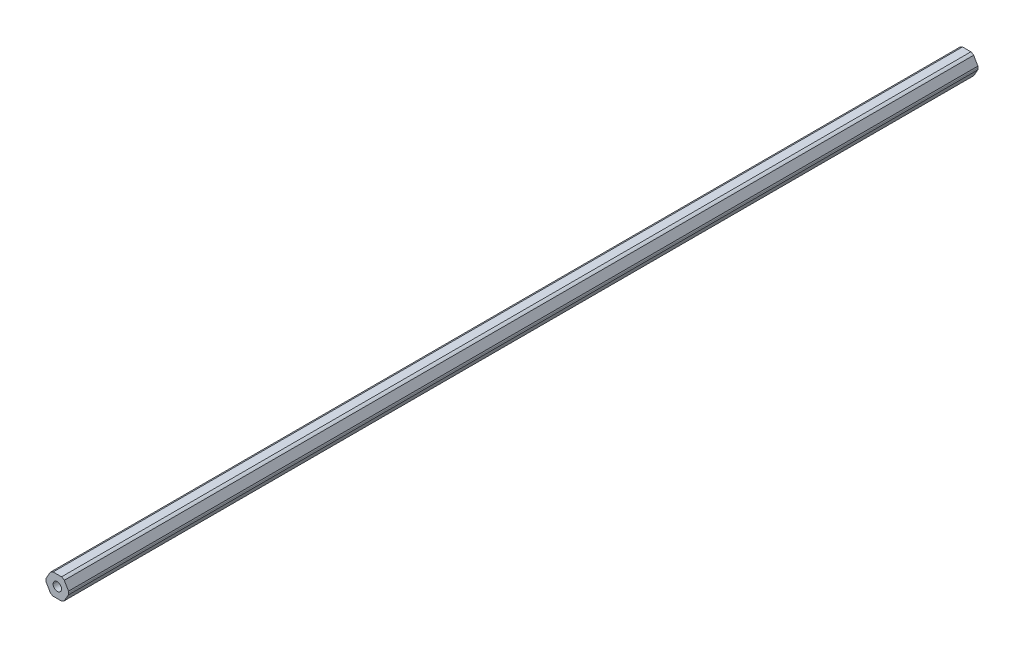
ISO-10303-21;
HEADER;
FILE_DESCRIPTION(('STEP AP214'),'2;1');
FILE_NAME('part.step','',(''),(''),'','','');
FILE_SCHEMA(('AUTOMOTIVE_DESIGN { 1 0 10303 214 1 1 1 1 }'));
ENDSEC;
DATA;
#1=APPLICATION_CONTEXT('core data for automotive mechanical design processes');
#2=APPLICATION_PROTOCOL_DEFINITION('international standard','automotive_design',2000,#1);
#3=PRODUCT_CONTEXT('',#1,'mechanical');
#4=PRODUCT('Part','Part','',(#3));
#5=PRODUCT_RELATED_PRODUCT_CATEGORY('part','',(#4));
#6=PRODUCT_DEFINITION_FORMATION('','',#4);
#7=PRODUCT_DEFINITION_CONTEXT('part definition',#1,'design');
#8=PRODUCT_DEFINITION('design','',#6,#7);
#9=PRODUCT_DEFINITION_SHAPE('','',#8);
#10=(LENGTH_UNIT() NAMED_UNIT(*) SI_UNIT(.MILLI.,.METRE.));
#11=(NAMED_UNIT(*) PLANE_ANGLE_UNIT() SI_UNIT($,.RADIAN.));
#12=(NAMED_UNIT(*) SI_UNIT($,.STERADIAN.) SOLID_ANGLE_UNIT());
#13=UNCERTAINTY_MEASURE_WITH_UNIT(LENGTH_MEASURE(1.E-05),#10,'distance_accuracy_value','');
#14=(GEOMETRIC_REPRESENTATION_CONTEXT(3) GLOBAL_UNCERTAINTY_ASSIGNED_CONTEXT((#13)) GLOBAL_UNIT_ASSIGNED_CONTEXT((#10,
#11,#12)) REPRESENTATION_CONTEXT('',''));
#15=CARTESIAN_POINT('',(0.,0.,0.));
#16=DIRECTION('',(0.,0.,1.));
#17=DIRECTION('',(1.,0.,0.));
#18=AXIS2_PLACEMENT_3D('',#15,#16,#17);
#19=CARTESIAN_POINT('',(0.,0.,-457.2));
#20=DIRECTION('',(0.,0.,1.));
#21=DIRECTION('',(1.,0.,0.));
#22=AXIS2_PLACEMENT_3D('',#19,#20,#21);
#23=CYLINDRICAL_SURFACE('',#22,2.55);
#24=CARTESIAN_POINT('',(0.,0.,-95.25));
#25=DIRECTION('',(0.,0.,-1.));
#26=DIRECTION('',(-1.,0.,0.));
#27=AXIS2_PLACEMENT_3D('',#24,#25,#26);
#28=CIRCLE('',#27,2.55);
#29=CARTESIAN_POINT('',(2.55,0.,-95.25));
#30=VERTEX_POINT('',#29);
#31=CARTESIAN_POINT('',(-2.55,0.,-95.25));
#32=VERTEX_POINT('',#31);
#33=EDGE_CURVE('E65',#30,#32,#28,.F.);
#34=ORIENTED_EDGE('',*,*,#33,.F.);
#35=DIRECTION('',(0.,0.,1.));
#36=VECTOR('',#35,1.);
#37=CARTESIAN_POINT('',(2.55,0.,-457.2));
#38=LINE('',#37,#36);
#39=CARTESIAN_POINT('',(2.55,0.,457.2));
#40=VERTEX_POINT('',#39);
#41=EDGE_CURVE('E168',#30,#40,#38,.T.);
#42=ORIENTED_EDGE('',*,*,#41,.T.);
#43=CARTESIAN_POINT('',(0.,0.,457.2));
#44=DIRECTION('',(0.,0.,1.));
#45=DIRECTION('',(1.,0.,0.));
#46=AXIS2_PLACEMENT_3D('',#43,#44,#45);
#47=CIRCLE('',#46,2.55);
#48=CARTESIAN_POINT('',(-2.55,0.,457.2));
#49=VERTEX_POINT('',#48);
#50=EDGE_CURVE('E52',#40,#49,#47,.T.);
#51=ORIENTED_EDGE('',*,*,#50,.T.);
#52=DIRECTION('',(0.,0.,1.));
#53=VECTOR('',#52,1.);
#54=CARTESIAN_POINT('',(-2.55,0.,-457.2));
#55=LINE('',#54,#53);
#56=EDGE_CURVE('E170',#32,#49,#55,.T.);
#57=ORIENTED_EDGE('',*,*,#56,.F.);
#58=EDGE_LOOP('',(#34,#42,#51,#57));
#59=FACE_BOUND('',#58,.T.);
#60=ADVANCED_FACE('F44',(#59),#23,.F.);
#61=CARTESIAN_POINT('',(0.,0.,-457.2));
#62=DIRECTION('',(0.,0.,1.));
#63=DIRECTION('',(1.,0.,0.));
#64=AXIS2_PLACEMENT_3D('',#61,#62,#63);
#65=CYLINDRICAL_SURFACE('',#64,6.87);
#66=DIRECTION('',(0.,0.,-1.));
#67=VECTOR('',#66,1.);
#68=CARTESIAN_POINT('',(4.24149521323254,5.40431479062105,-457.2));
#69=LINE('',#68,#67);
#70=CARTESIAN_POINT('',(4.24149521323254,5.40431479062105,457.2));
#71=VERTEX_POINT('',#70);
#72=CARTESIAN_POINT('',(4.24149521323254,5.40431479062105,-95.25));
#73=VERTEX_POINT('',#72);
#74=EDGE_CURVE('E195',#71,#73,#69,.T.);
#75=ORIENTED_EDGE('',*,*,#74,.T.);
#76=CARTESIAN_POINT('',(0.,0.,-95.25));
#77=DIRECTION('',(0.,0.,-1.));
#78=DIRECTION('',(-1.,0.,0.));
#79=AXIS2_PLACEMENT_3D('',#76,#77,#78);
#80=CIRCLE('',#79,6.87);
#81=CARTESIAN_POINT('',(2.55952629210953,6.3754,-95.25));
#82=VERTEX_POINT('',#81);
#83=EDGE_CURVE('E335',#73,#82,#80,.F.);
#84=ORIENTED_EDGE('',*,*,#83,.T.);
#85=DIRECTION('',(0.,0.,1.));
#86=VECTOR('',#85,1.);
#87=CARTESIAN_POINT('',(2.55952629210952,6.3754,-457.2));
#88=LINE('',#87,#86);
#89=CARTESIAN_POINT('',(2.55952629210952,6.3754,457.2));
#90=VERTEX_POINT('',#89);
#91=EDGE_CURVE('E212',#82,#90,#88,.T.);
#92=ORIENTED_EDGE('',*,*,#91,.T.);
#93=CARTESIAN_POINT('',(0.,0.,457.2));
#94=DIRECTION('',(0.,0.,1.));
#95=DIRECTION('',(1.,0.,0.));
#96=AXIS2_PLACEMENT_3D('',#93,#94,#95);
#97=CIRCLE('',#96,6.87);
#98=EDGE_CURVE('E222',#71,#90,#97,.T.);
#99=ORIENTED_EDGE('',*,*,#98,.F.);
#100=EDGE_LOOP('',(#75,#84,#92,#99));
#101=FACE_BOUND('',#100,.T.);
#102=ADVANCED_FACE('F359',(#101),#65,.T.);
#103=CARTESIAN_POINT('',(0.,0.,-457.2));
#104=DIRECTION('',(0.,0.,1.));
#105=DIRECTION('',(1.,0.,0.));
#106=AXIS2_PLACEMENT_3D('',#103,#104,#105);
#107=CYLINDRICAL_SURFACE('',#106,6.87);
#108=DIRECTION('',(0.,0.,-1.));
#109=VECTOR('',#108,1.);
#110=CARTESIAN_POINT('',(-2.55952629210953,6.3754,-457.2));
#111=LINE('',#110,#109);
#112=CARTESIAN_POINT('',(-2.55952629210953,6.3754,457.2));
#113=VERTEX_POINT('',#112);
#114=CARTESIAN_POINT('',(-2.55952629210953,6.3754,-95.25));
#115=VERTEX_POINT('',#114);
#116=EDGE_CURVE('E207',#113,#115,#111,.T.);
#117=ORIENTED_EDGE('',*,*,#116,.T.);
#118=CARTESIAN_POINT('',(0.,0.,-95.25));
#119=DIRECTION('',(0.,0.,-1.));
#120=DIRECTION('',(-1.,0.,0.));
#121=AXIS2_PLACEMENT_3D('',#118,#119,#120);
#122=CIRCLE('',#121,6.87);
#123=CARTESIAN_POINT('',(-4.24149521323255,5.40431479062105,-95.25));
#124=VERTEX_POINT('',#123);
#125=EDGE_CURVE('E343',#115,#124,#122,.F.);
#126=ORIENTED_EDGE('',*,*,#125,.T.);
#127=DIRECTION('',(0.,0.,1.));
#128=VECTOR('',#127,1.);
#129=CARTESIAN_POINT('',(-4.24149521323255,5.40431479062105,-457.2));
#130=LINE('',#129,#128);
#131=CARTESIAN_POINT('',(-4.24149521323255,5.40431479062105,457.2));
#132=VERTEX_POINT('',#131);
#133=EDGE_CURVE('E206',#124,#132,#130,.T.);
#134=ORIENTED_EDGE('',*,*,#133,.T.);
#135=CARTESIAN_POINT('',(0.,0.,457.2));
#136=DIRECTION('',(0.,0.,1.));
#137=DIRECTION('',(1.,0.,0.));
#138=AXIS2_PLACEMENT_3D('',#135,#136,#137);
#139=CIRCLE('',#138,6.87);
#140=EDGE_CURVE('E235',#113,#132,#139,.T.);
#141=ORIENTED_EDGE('',*,*,#140,.F.);
#142=EDGE_LOOP('',(#117,#126,#134,#141));
#143=FACE_BOUND('',#142,.T.);
#144=ADVANCED_FACE('F351',(#143),#107,.T.);
#145=CARTESIAN_POINT('',(0.,0.,-457.2));
#146=DIRECTION('',(0.,0.,1.));
#147=DIRECTION('',(1.,0.,0.));
#148=AXIS2_PLACEMENT_3D('',#145,#146,#147);
#149=CYLINDRICAL_SURFACE('',#148,6.87);
#150=DIRECTION('',(0.,0.,-1.));
#151=VECTOR('',#150,1.);
#152=CARTESIAN_POINT('',(-6.80102150534208,0.97108520937896,-457.2));
#153=LINE('',#152,#151);
#154=CARTESIAN_POINT('',(-6.80102150534208,0.97108520937896,457.2));
#155=VERTEX_POINT('',#154);
#156=CARTESIAN_POINT('',(-6.80102150534208,0.97108520937896,-95.25));
#157=VERTEX_POINT('',#156);
#158=EDGE_CURVE('E287',#155,#157,#153,.T.);
#159=ORIENTED_EDGE('',*,*,#158,.T.);
#160=CARTESIAN_POINT('',(0.,0.,-95.25));
#161=DIRECTION('',(0.,0.,-1.));
#162=DIRECTION('',(-1.,0.,0.));
#163=AXIS2_PLACEMENT_3D('',#160,#161,#162);
#164=CIRCLE('',#163,6.87);
#165=CARTESIAN_POINT('',(-6.80102150534207,-0.971085209378956,-95.25));
#166=VERTEX_POINT('',#165);
#167=EDGE_CURVE('E342',#157,#166,#164,.F.);
#168=ORIENTED_EDGE('',*,*,#167,.T.);
#169=DIRECTION('',(0.,0.,1.));
#170=VECTOR('',#169,1.);
#171=CARTESIAN_POINT('',(-6.80102150534208,-0.971085209378962,-457.2));
#172=LINE('',#171,#170);
#173=CARTESIAN_POINT('',(-6.80102150534208,-0.971085209378956,457.2));
#174=VERTEX_POINT('',#173);
#175=EDGE_CURVE('E185',#166,#174,#172,.T.);
#176=ORIENTED_EDGE('',*,*,#175,.T.);
#177=CARTESIAN_POINT('',(0.,0.,457.2));
#178=DIRECTION('',(0.,0.,1.));
#179=DIRECTION('',(1.,0.,0.));
#180=AXIS2_PLACEMENT_3D('',#177,#178,#179);
#181=CIRCLE('',#180,6.87);
#182=EDGE_CURVE('E228',#155,#174,#181,.T.);
#183=ORIENTED_EDGE('',*,*,#182,.F.);
#184=EDGE_LOOP('',(#159,#168,#176,#183));
#185=FACE_BOUND('',#184,.T.);
#186=ADVANCED_FACE('F366',(#185),#149,.T.);
#187=CARTESIAN_POINT('',(0.,0.,-457.2));
#188=DIRECTION('',(0.,0.,1.));
#189=DIRECTION('',(1.,0.,0.));
#190=AXIS2_PLACEMENT_3D('',#187,#188,#189);
#191=CYLINDRICAL_SURFACE('',#190,6.87);
#192=DIRECTION('',(0.,0.,-1.));
#193=VECTOR('',#192,1.);
#194=CARTESIAN_POINT('',(-4.24149521323255,-5.40431479062104,-457.2));
#195=LINE('',#194,#193);
#196=CARTESIAN_POINT('',(-4.24149521323254,-5.40431479062105,457.2));
#197=VERTEX_POINT('',#196);
#198=CARTESIAN_POINT('',(-4.24149521323254,-5.40431479062105,-95.25));
#199=VERTEX_POINT('',#198);
#200=EDGE_CURVE('E187',#197,#199,#195,.T.);
#201=ORIENTED_EDGE('',*,*,#200,.T.);
#202=CARTESIAN_POINT('',(0.,0.,-95.25));
#203=DIRECTION('',(0.,0.,-1.));
#204=DIRECTION('',(-1.,0.,0.));
#205=AXIS2_PLACEMENT_3D('',#202,#203,#204);
#206=CIRCLE('',#205,6.87);
#207=CARTESIAN_POINT('',(-2.55952629210953,-6.3754,-95.25));
#208=VERTEX_POINT('',#207);
#209=EDGE_CURVE('E309',#199,#208,#206,.F.);
#210=ORIENTED_EDGE('',*,*,#209,.T.);
#211=DIRECTION('',(0.,0.,1.));
#212=VECTOR('',#211,1.);
#213=CARTESIAN_POINT('',(-2.55952629210953,-6.3754,-457.2));
#214=LINE('',#213,#212);
#215=CARTESIAN_POINT('',(-2.55952629210953,-6.3754,457.2));
#216=VERTEX_POINT('',#215);
#217=EDGE_CURVE('E218',#208,#216,#214,.T.);
#218=ORIENTED_EDGE('',*,*,#217,.T.);
#219=CARTESIAN_POINT('',(0.,0.,457.2));
#220=DIRECTION('',(0.,0.,1.));
#221=DIRECTION('',(1.,0.,0.));
#222=AXIS2_PLACEMENT_3D('',#219,#220,#221);
#223=CIRCLE('',#222,6.87);
#224=EDGE_CURVE('E223',#197,#216,#223,.T.);
#225=ORIENTED_EDGE('',*,*,#224,.F.);
#226=EDGE_LOOP('',(#201,#210,#218,#225));
#227=FACE_BOUND('',#226,.T.);
#228=ADVANCED_FACE('F308',(#227),#191,.T.);
#229=CARTESIAN_POINT('',(0.,0.,-457.2));
#230=DIRECTION('',(0.,0.,1.));
#231=DIRECTION('',(1.,0.,0.));
#232=AXIS2_PLACEMENT_3D('',#229,#230,#231);
#233=CYLINDRICAL_SURFACE('',#232,6.87);
#234=DIRECTION('',(0.,0.,-1.));
#235=VECTOR('',#234,1.);
#236=CARTESIAN_POINT('',(2.55952629210953,-6.3754,-457.2));
#237=LINE('',#236,#235);
#238=CARTESIAN_POINT('',(2.55952629210953,-6.3754,457.2));
#239=VERTEX_POINT('',#238);
#240=CARTESIAN_POINT('',(2.55952629210953,-6.3754,-95.25));
#241=VERTEX_POINT('',#240);
#242=EDGE_CURVE('E213',#239,#241,#237,.T.);
#243=ORIENTED_EDGE('',*,*,#242,.T.);
#244=CARTESIAN_POINT('',(0.,0.,-95.25));
#245=DIRECTION('',(0.,0.,-1.));
#246=DIRECTION('',(-1.,0.,0.));
#247=AXIS2_PLACEMENT_3D('',#244,#245,#246);
#248=CIRCLE('',#247,6.87);
#249=CARTESIAN_POINT('',(4.24149521323254,-5.40431479062105,-95.25));
#250=VERTEX_POINT('',#249);
#251=EDGE_CURVE('E321',#241,#250,#248,.F.);
#252=ORIENTED_EDGE('',*,*,#251,.T.);
#253=DIRECTION('',(0.,0.,1.));
#254=VECTOR('',#253,1.);
#255=CARTESIAN_POINT('',(4.24149521323255,-5.40431479062104,-457.2));
#256=LINE('',#255,#254);
#257=CARTESIAN_POINT('',(4.24149521323254,-5.40431479062105,457.2));
#258=VERTEX_POINT('',#257);
#259=EDGE_CURVE('E201',#250,#258,#256,.T.);
#260=ORIENTED_EDGE('',*,*,#259,.T.);
#261=CARTESIAN_POINT('',(0.,0.,457.2));
#262=DIRECTION('',(0.,0.,1.));
#263=DIRECTION('',(1.,0.,0.));
#264=AXIS2_PLACEMENT_3D('',#261,#262,#263);
#265=CIRCLE('',#264,6.87);
#266=EDGE_CURVE('E227',#239,#258,#265,.T.);
#267=ORIENTED_EDGE('',*,*,#266,.F.);
#268=EDGE_LOOP('',(#243,#252,#260,#267));
#269=FACE_BOUND('',#268,.T.);
#270=ADVANCED_FACE('F320',(#269),#233,.T.);
#271=CARTESIAN_POINT('',(0.,0.,-457.2));
#272=DIRECTION('',(0.,0.,1.));
#273=DIRECTION('',(1.,0.,0.));
#274=AXIS2_PLACEMENT_3D('',#271,#272,#273);
#275=CYLINDRICAL_SURFACE('',#274,6.87);
#276=DIRECTION('',(0.,0.,1.));
#277=VECTOR('',#276,1.);
#278=CARTESIAN_POINT('',(6.87,0.,-457.2));
#279=LINE('',#278,#277);
#280=CARTESIAN_POINT('',(6.87,0.,-95.25));
#281=VERTEX_POINT('',#280);
#282=CARTESIAN_POINT('',(6.87,0.,457.2));
#283=VERTEX_POINT('',#282);
#284=EDGE_CURVE('E177',#281,#283,#279,.T.);
#285=ORIENTED_EDGE('',*,*,#284,.F.);
#286=CARTESIAN_POINT('',(0.,0.,-95.25));
#287=DIRECTION('',(0.,0.,-1.));
#288=DIRECTION('',(-1.,0.,0.));
#289=AXIS2_PLACEMENT_3D('',#286,#287,#288);
#290=CIRCLE('',#289,6.87);
#291=CARTESIAN_POINT('',(6.80102150534208,0.97108520937895,-95.25));
#292=VERTEX_POINT('',#291);
#293=EDGE_CURVE('E59',#281,#292,#290,.F.);
#294=ORIENTED_EDGE('',*,*,#293,.T.);
#295=DIRECTION('',(0.,0.,1.));
#296=VECTOR('',#295,1.);
#297=CARTESIAN_POINT('',(6.80102150534208,0.971085209378949,-457.2));
#298=LINE('',#297,#296);
#299=CARTESIAN_POINT('',(6.80102150534208,0.97108520937895,457.2));
#300=VERTEX_POINT('',#299);
#301=EDGE_CURVE('E193',#292,#300,#298,.T.);
#302=ORIENTED_EDGE('',*,*,#301,.T.);
#303=CARTESIAN_POINT('',(0.,0.,457.2));
#304=DIRECTION('',(0.,0.,1.));
#305=DIRECTION('',(1.,0.,0.));
#306=AXIS2_PLACEMENT_3D('',#303,#304,#305);
#307=CIRCLE('',#306,6.87);
#308=EDGE_CURVE('E237',#283,#300,#307,.T.);
#309=ORIENTED_EDGE('',*,*,#308,.F.);
#310=EDGE_LOOP('',(#285,#294,#302,#309));
#311=FACE_BOUND('',#310,.T.);
#312=ADVANCED_FACE('F271',(#311),#275,.T.);
#313=CARTESIAN_POINT('',(-3.68083890619154,-6.3754,457.2));
#314=DIRECTION('',(0.,1.,0.));
#315=DIRECTION('',(1.,0.,0.));
#316=AXIS2_PLACEMENT_3D('',#313,#314,#315);
#317=PLANE('',#316);
#318=DIRECTION('',(-1.,0.,0.));
#319=VECTOR('',#318,1.);
#320=CARTESIAN_POINT('',(-3.68083890619154,-6.3754,-95.25));
#321=LINE('',#320,#319);
#322=EDGE_CURVE('E317',#241,#208,#321,.T.);
#323=ORIENTED_EDGE('',*,*,#322,.F.);
#324=ORIENTED_EDGE('',*,*,#242,.F.);
#325=DIRECTION('',(1.,0.,0.));
#326=VECTOR('',#325,1.);
#327=CARTESIAN_POINT('',(-3.68083890619154,-6.3754,457.2));
#328=LINE('',#327,#326);
#329=EDGE_CURVE('E217',#216,#239,#328,.T.);
#330=ORIENTED_EDGE('',*,*,#329,.F.);
#331=ORIENTED_EDGE('',*,*,#217,.F.);
#332=EDGE_LOOP('',(#323,#324,#330,#331));
#333=FACE_BOUND('',#332,.T.);
#334=ADVANCED_FACE('F316',(#333),#317,.F.);
#335=CARTESIAN_POINT('',(-7.36167781238308,0.,457.2));
#336=DIRECTION('',(0.866025403784439,0.5,0.));
#337=DIRECTION('',(0.,0.,-1.));
#338=AXIS2_PLACEMENT_3D('',#335,#336,#337);
#339=PLANE('',#338);
#340=DIRECTION('',(-0.5,0.866025403784439,0.));
#341=VECTOR('',#340,1.);
#342=CARTESIAN_POINT('',(-7.36167781238308,0.,-95.25));
#343=LINE('',#342,#341);
#344=EDGE_CURVE('E340',#199,#166,#343,.T.);
#345=ORIENTED_EDGE('',*,*,#344,.F.);
#346=ORIENTED_EDGE('',*,*,#200,.F.);
#347=DIRECTION('',(0.5,-0.866025403784439,0.));
#348=VECTOR('',#347,1.);
#349=CARTESIAN_POINT('',(-7.36167781238308,0.,457.2));
#350=LINE('',#349,#348);
#351=EDGE_CURVE('E191',#174,#197,#350,.T.);
#352=ORIENTED_EDGE('',*,*,#351,.F.);
#353=ORIENTED_EDGE('',*,*,#175,.F.);
#354=EDGE_LOOP('',(#345,#346,#352,#353));
#355=FACE_BOUND('',#354,.T.);
#356=ADVANCED_FACE('F46',(#355),#339,.F.);
#357=CARTESIAN_POINT('',(-3.68083890619154,6.3754,457.2));
#358=DIRECTION('',(0.866025403784439,-0.5,0.));
#359=DIRECTION('',(0.,0.,-1.));
#360=AXIS2_PLACEMENT_3D('',#357,#358,#359);
#361=PLANE('',#360);
#362=DIRECTION('',(0.5,0.866025403784439,0.));
#363=VECTOR('',#362,1.);
#364=CARTESIAN_POINT('',(-3.68083890619154,6.3754,-95.25));
#365=LINE('',#364,#363);
#366=EDGE_CURVE('E288',#157,#124,#365,.T.);
#367=ORIENTED_EDGE('',*,*,#366,.F.);
#368=ORIENTED_EDGE('',*,*,#158,.F.);
#369=DIRECTION('',(-0.5,-0.866025403784439,0.));
#370=VECTOR('',#369,1.);
#371=CARTESIAN_POINT('',(-3.68083890619154,6.3754,457.2));
#372=LINE('',#371,#370);
#373=EDGE_CURVE('E188',#132,#155,#372,.T.);
#374=ORIENTED_EDGE('',*,*,#373,.F.);
#375=ORIENTED_EDGE('',*,*,#133,.F.);
#376=EDGE_LOOP('',(#367,#368,#374,#375));
#377=FACE_BOUND('',#376,.T.);
#378=ADVANCED_FACE('F350',(#377),#361,.F.);
#379=CARTESIAN_POINT('',(3.68083890619154,6.3754,457.2));
#380=DIRECTION('',(0.,-1.,0.));
#381=DIRECTION('',(0.,0.,-1.));
#382=AXIS2_PLACEMENT_3D('',#379,#380,#381);
#383=PLANE('',#382);
#384=DIRECTION('',(1.,0.,0.));
#385=VECTOR('',#384,1.);
#386=CARTESIAN_POINT('',(3.68083890619154,6.3754,-95.25));
#387=LINE('',#386,#385);
#388=EDGE_CURVE('E338',#115,#82,#387,.T.);
#389=ORIENTED_EDGE('',*,*,#388,.F.);
#390=ORIENTED_EDGE('',*,*,#116,.F.);
#391=DIRECTION('',(-1.,0.,0.));
#392=VECTOR('',#391,1.);
#393=CARTESIAN_POINT('',(3.68083890619154,6.3754,457.2));
#394=LINE('',#393,#392);
#395=EDGE_CURVE('E202',#90,#113,#394,.T.);
#396=ORIENTED_EDGE('',*,*,#395,.F.);
#397=ORIENTED_EDGE('',*,*,#91,.F.);
#398=EDGE_LOOP('',(#389,#390,#396,#397));
#399=FACE_BOUND('',#398,.T.);
#400=ADVANCED_FACE('F357',(#399),#383,.F.);
#401=CARTESIAN_POINT('',(7.36167781238308,0.,457.2));
#402=DIRECTION('',(-0.866025403784439,-0.5,0.));
#403=DIRECTION('',(-0.5,0.866025403784439,0.));
#404=AXIS2_PLACEMENT_3D('',#401,#402,#403);
#405=PLANE('',#404);
#406=DIRECTION('',(0.5,-0.866025403784439,0.));
#407=VECTOR('',#406,1.);
#408=CARTESIAN_POINT('',(7.36167781238308,0.,-95.25));
#409=LINE('',#408,#407);
#410=EDGE_CURVE('E277',#73,#292,#409,.T.);
#411=ORIENTED_EDGE('',*,*,#410,.F.);
#412=ORIENTED_EDGE('',*,*,#74,.F.);
#413=DIRECTION('',(-0.5,0.866025403784439,0.));
#414=VECTOR('',#413,1.);
#415=CARTESIAN_POINT('',(7.36167781238308,0.,457.2));
#416=LINE('',#415,#414);
#417=EDGE_CURVE('E232',#300,#71,#416,.T.);
#418=ORIENTED_EDGE('',*,*,#417,.F.);
#419=ORIENTED_EDGE('',*,*,#301,.F.);
#420=EDGE_LOOP('',(#411,#412,#418,#419));
#421=FACE_BOUND('',#420,.T.);
#422=ADVANCED_FACE('F275',(#421),#405,.F.);
#423=CARTESIAN_POINT('',(3.68083890619154,-6.3754,457.2));
#424=DIRECTION('',(-0.866025403784439,0.5,0.));
#425=DIRECTION('',(0.,0.,1.));
#426=AXIS2_PLACEMENT_3D('',#423,#424,#425);
#427=PLANE('',#426);
#428=DIRECTION('',(-0.5,-0.866025403784439,0.));
#429=VECTOR('',#428,1.);
#430=CARTESIAN_POINT('',(3.68083890619154,-6.3754,-95.25));
#431=LINE('',#430,#429);
#432=CARTESIAN_POINT('',(6.80102150534208,-0.971085209378955,-95.25));
#433=VERTEX_POINT('',#432);
#434=EDGE_CURVE('E326',#433,#250,#431,.T.);
#435=ORIENTED_EDGE('',*,*,#434,.F.);
#436=DIRECTION('',(0.,0.,-1.));
#437=VECTOR('',#436,1.);
#438=CARTESIAN_POINT('',(6.80102150534208,-0.971085209378962,-457.2));
#439=LINE('',#438,#437);
#440=CARTESIAN_POINT('',(6.80102150534208,-0.971085209378955,457.2));
#441=VERTEX_POINT('',#440);
#442=EDGE_CURVE('E197',#441,#433,#439,.T.);
#443=ORIENTED_EDGE('',*,*,#442,.F.);
#444=DIRECTION('',(0.5,0.866025403784439,0.));
#445=VECTOR('',#444,1.);
#446=CARTESIAN_POINT('',(3.68083890619154,-6.3754,457.2));
#447=LINE('',#446,#445);
#448=EDGE_CURVE('E196',#258,#441,#447,.T.);
#449=ORIENTED_EDGE('',*,*,#448,.F.);
#450=ORIENTED_EDGE('',*,*,#259,.F.);
#451=EDGE_LOOP('',(#435,#443,#449,#450));
#452=FACE_BOUND('',#451,.T.);
#453=ADVANCED_FACE('F325',(#452),#427,.F.);
#454=CARTESIAN_POINT('',(0.,0.,-457.2));
#455=DIRECTION('',(0.,0.,1.));
#456=DIRECTION('',(1.,0.,0.));
#457=AXIS2_PLACEMENT_3D('',#454,#455,#456);
#458=CYLINDRICAL_SURFACE('',#457,6.87);
#459=ORIENTED_EDGE('',*,*,#442,.T.);
#460=CARTESIAN_POINT('',(0.,0.,-95.25));
#461=DIRECTION('',(0.,0.,-1.));
#462=DIRECTION('',(-1.,0.,0.));
#463=AXIS2_PLACEMENT_3D('',#460,#461,#462);
#464=CIRCLE('',#463,6.87);
#465=EDGE_CURVE('E171',#433,#281,#464,.F.);
#466=ORIENTED_EDGE('',*,*,#465,.T.);
#467=ORIENTED_EDGE('',*,*,#284,.T.);
#468=CARTESIAN_POINT('',(0.,0.,457.2));
#469=DIRECTION('',(0.,0.,1.));
#470=DIRECTION('',(1.,0.,0.));
#471=AXIS2_PLACEMENT_3D('',#468,#469,#470);
#472=CIRCLE('',#471,6.87);
#473=EDGE_CURVE('E179',#441,#283,#472,.T.);
#474=ORIENTED_EDGE('',*,*,#473,.F.);
#475=EDGE_LOOP('',(#459,#466,#467,#474));
#476=FACE_BOUND('',#475,.T.);
#477=ADVANCED_FACE('F268',(#476),#458,.T.);
#478=CARTESIAN_POINT('',(0.,0.,-457.2));
#479=DIRECTION('',(0.,0.,1.));
#480=DIRECTION('',(1.,0.,0.));
#481=AXIS2_PLACEMENT_3D('',#478,#479,#480);
#482=CYLINDRICAL_SURFACE('',#481,2.55);
#483=CARTESIAN_POINT('',(0.,0.,-95.25));
#484=DIRECTION('',(0.,0.,-1.));
#485=DIRECTION('',(-1.,0.,0.));
#486=AXIS2_PLACEMENT_3D('',#483,#484,#485);
#487=CIRCLE('',#486,2.55);
#488=EDGE_CURVE('E11',#32,#30,#487,.F.);
#489=ORIENTED_EDGE('',*,*,#488,.F.);
#490=ORIENTED_EDGE('',*,*,#56,.T.);
#491=CARTESIAN_POINT('',(0.,0.,457.2));
#492=DIRECTION('',(0.,0.,1.));
#493=DIRECTION('',(1.,0.,0.));
#494=AXIS2_PLACEMENT_3D('',#491,#492,#493);
#495=CIRCLE('',#494,2.55);
#496=EDGE_CURVE('E176',#49,#40,#495,.T.);
#497=ORIENTED_EDGE('',*,*,#496,.T.);
#498=ORIENTED_EDGE('',*,*,#41,.F.);
#499=EDGE_LOOP('',(#489,#490,#497,#498));
#500=FACE_BOUND('',#499,.T.);
#501=ADVANCED_FACE('F174',(#500),#482,.F.);
#502=CARTESIAN_POINT('',(0.,0.,457.2));
#503=DIRECTION('',(0.,0.,1.));
#504=DIRECTION('',(1.,0.,0.));
#505=AXIS2_PLACEMENT_3D('',#502,#503,#504);
#506=PLANE('',#505);
#507=ORIENTED_EDGE('',*,*,#50,.F.);
#508=ORIENTED_EDGE('',*,*,#496,.F.);
#509=EDGE_LOOP('',(#507,#508));
#510=FACE_BOUND('',#509,.T.);
#511=ORIENTED_EDGE('',*,*,#417,.T.);
#512=ORIENTED_EDGE('',*,*,#98,.T.);
#513=ORIENTED_EDGE('',*,*,#395,.T.);
#514=ORIENTED_EDGE('',*,*,#140,.T.);
#515=ORIENTED_EDGE('',*,*,#373,.T.);
#516=ORIENTED_EDGE('',*,*,#182,.T.);
#517=ORIENTED_EDGE('',*,*,#351,.T.);
#518=ORIENTED_EDGE('',*,*,#224,.T.);
#519=ORIENTED_EDGE('',*,*,#329,.T.);
#520=ORIENTED_EDGE('',*,*,#266,.T.);
#521=ORIENTED_EDGE('',*,*,#448,.T.);
#522=ORIENTED_EDGE('',*,*,#473,.T.);
#523=ORIENTED_EDGE('',*,*,#308,.T.);
#524=EDGE_LOOP('',(#511,#512,#513,#514,#515,#516,#517,#518,#519,#520,#521,#522,#523));
#525=FACE_BOUND('',#524,.T.);
#526=ADVANCED_FACE('F264',(#510,#525),#506,.T.);
#527=CARTESIAN_POINT('',(0.,0.,-95.25));
#528=DIRECTION('',(0.,0.,-1.));
#529=DIRECTION('',(-1.,0.,0.));
#530=AXIS2_PLACEMENT_3D('',#527,#528,#529);
#531=PLANE('',#530);
#532=ORIENTED_EDGE('',*,*,#33,.T.);
#533=ORIENTED_EDGE('',*,*,#488,.T.);
#534=EDGE_LOOP('',(#532,#533));
#535=FACE_BOUND('',#534,.T.);
#536=ORIENTED_EDGE('',*,*,#366,.T.);
#537=ORIENTED_EDGE('',*,*,#125,.F.);
#538=ORIENTED_EDGE('',*,*,#388,.T.);
#539=ORIENTED_EDGE('',*,*,#83,.F.);
#540=ORIENTED_EDGE('',*,*,#410,.T.);
#541=ORIENTED_EDGE('',*,*,#293,.F.);
#542=ORIENTED_EDGE('',*,*,#465,.F.);
#543=ORIENTED_EDGE('',*,*,#434,.T.);
#544=ORIENTED_EDGE('',*,*,#251,.F.);
#545=ORIENTED_EDGE('',*,*,#322,.T.);
#546=ORIENTED_EDGE('',*,*,#209,.F.);
#547=ORIENTED_EDGE('',*,*,#344,.T.);
#548=ORIENTED_EDGE('',*,*,#167,.F.);
#549=EDGE_LOOP('',(#536,#537,#538,#539,#540,#541,#542,#543,#544,#545,#546,#547,#548));
#550=FACE_BOUND('',#549,.T.);
#551=ADVANCED_FACE('F162',(#535,#550),#531,.T.);
#552=CLOSED_SHELL('',(#60,#102,#144,#186,#228,#270,#312,#334,#356,#378,#400,#422,#453,#477,#501,
#526,#551));
#553=MANIFOLD_SOLID_BREP('B2',#552);
#554=ADVANCED_BREP_SHAPE_REPRESENTATION('',(#18,#553),#14);
#555=SHAPE_DEFINITION_REPRESENTATION(#9,#554);
ENDSEC;
END-ISO-10303-21;
